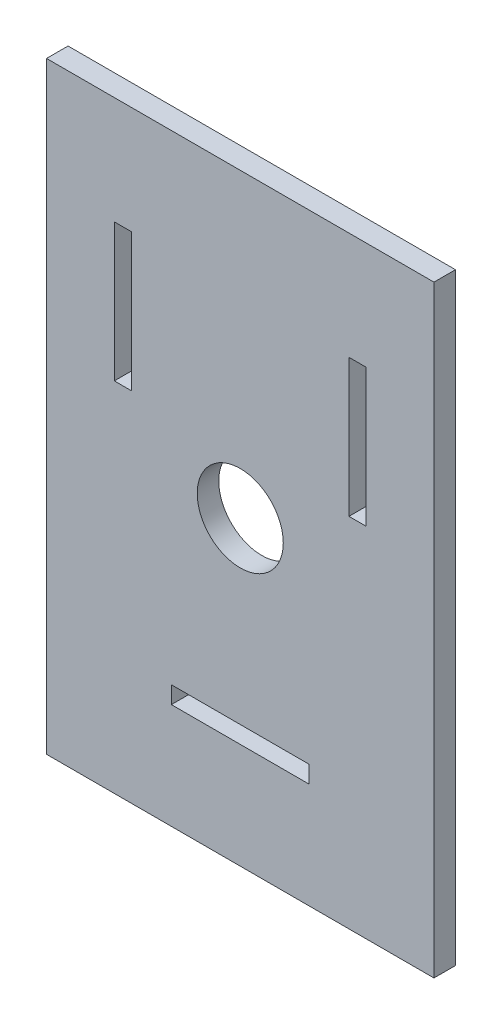
ISO-10303-21;
HEADER;
FILE_DESCRIPTION(('STEP AP214'),'2;1');
FILE_NAME('part.step','',(''),(''),'','','');
FILE_SCHEMA(('AUTOMOTIVE_DESIGN { 1 0 10303 214 1 1 1 1 }'));
ENDSEC;
DATA;
#1=APPLICATION_CONTEXT('core data for automotive mechanical design processes');
#2=APPLICATION_PROTOCOL_DEFINITION('international standard','automotive_design',2000,#1);
#3=PRODUCT_CONTEXT('',#1,'mechanical');
#4=PRODUCT('Part','Part','',(#3));
#5=PRODUCT_RELATED_PRODUCT_CATEGORY('part','',(#4));
#6=PRODUCT_DEFINITION_FORMATION('','',#4);
#7=PRODUCT_DEFINITION_CONTEXT('part definition',#1,'design');
#8=PRODUCT_DEFINITION('design','',#6,#7);
#9=PRODUCT_DEFINITION_SHAPE('','',#8);
#10=(LENGTH_UNIT() NAMED_UNIT(*) SI_UNIT(.MILLI.,.METRE.));
#11=(NAMED_UNIT(*) PLANE_ANGLE_UNIT() SI_UNIT($,.RADIAN.));
#12=(NAMED_UNIT(*) SI_UNIT($,.STERADIAN.) SOLID_ANGLE_UNIT());
#13=UNCERTAINTY_MEASURE_WITH_UNIT(LENGTH_MEASURE(1.E-05),#10,'distance_accuracy_value','');
#14=(GEOMETRIC_REPRESENTATION_CONTEXT(3) GLOBAL_UNCERTAINTY_ASSIGNED_CONTEXT((#13)) GLOBAL_UNIT_ASSIGNED_CONTEXT((#10,
#11,#12)) REPRESENTATION_CONTEXT('',''));
#15=CARTESIAN_POINT('',(0.,0.,0.));
#16=DIRECTION('',(0.,0.,1.));
#17=DIRECTION('',(1.,0.,0.));
#18=AXIS2_PLACEMENT_3D('',#15,#16,#17);
#19=CARTESIAN_POINT('',(0.,0.,-1.));
#20=DIRECTION('',(0.,0.,1.));
#21=DIRECTION('',(1.,0.,0.));
#22=AXIS2_PLACEMENT_3D('',#19,#20,#21);
#23=PLANE('',#22);
#24=DIRECTION('',(1.,0.,0.));
#25=VECTOR('',#24,1.);
#26=CARTESIAN_POINT('',(0.,-9.09999999999999,-1.));
#27=LINE('',#26,#25);
#28=CARTESIAN_POINT('',(-3.2,-9.09999999999999,-1.));
#29=VERTEX_POINT('',#28);
#30=CARTESIAN_POINT('',(3.2,-9.09999999999999,-1.));
#31=VERTEX_POINT('',#30);
#32=EDGE_CURVE('E162',#29,#31,#27,.T.);
#33=ORIENTED_EDGE('',*,*,#32,.T.);
#34=DIRECTION('',(0.,1.,0.));
#35=VECTOR('',#34,1.);
#36=CARTESIAN_POINT('',(3.2,0.,-1.));
#37=LINE('',#36,#35);
#38=CARTESIAN_POINT('',(3.2,-8.29999999999999,-1.));
#39=VERTEX_POINT('',#38);
#40=EDGE_CURVE('E165',#31,#39,#37,.T.);
#41=ORIENTED_EDGE('',*,*,#40,.T.);
#42=DIRECTION('',(-1.,0.,0.));
#43=VECTOR('',#42,1.);
#44=CARTESIAN_POINT('',(0.,-8.29999999999999,-1.));
#45=LINE('',#44,#43);
#46=CARTESIAN_POINT('',(-3.2,-8.29999999999999,-1.));
#47=VERTEX_POINT('',#46);
#48=EDGE_CURVE('E157',#39,#47,#45,.T.);
#49=ORIENTED_EDGE('',*,*,#48,.T.);
#50=DIRECTION('',(0.,-1.,0.));
#51=VECTOR('',#50,1.);
#52=CARTESIAN_POINT('',(-3.2,0.,-1.));
#53=LINE('',#52,#51);
#54=EDGE_CURVE('E137',#47,#29,#53,.T.);
#55=ORIENTED_EDGE('',*,*,#54,.T.);
#56=EDGE_LOOP('',(#33,#41,#49,#55));
#57=FACE_BOUND('',#56,.T.);
#58=CARTESIAN_POINT('',(0.,0.,-1.));
#59=DIRECTION('',(0.,0.,1.));
#60=DIRECTION('',(1.,0.,0.));
#61=AXIS2_PLACEMENT_3D('',#58,#59,#60);
#62=CIRCLE('',#61,2.);
#63=CARTESIAN_POINT('',(2.,0.,-1.));
#64=VERTEX_POINT('',#63);
#65=EDGE_CURVE('E169',#64,#64,#62,.T.);
#66=ORIENTED_EDGE('',*,*,#65,.T.);
#67=EDGE_LOOP('',(#66));
#68=FACE_BOUND('',#67,.T.);
#69=DIRECTION('',(0.,1.,0.));
#70=VECTOR('',#69,1.);
#71=CARTESIAN_POINT('',(8.99999999999999,14.,-1.));
#72=LINE('',#71,#70);
#73=CARTESIAN_POINT('',(9.,-14.,-1.));
#74=VERTEX_POINT('',#73);
#75=CARTESIAN_POINT('',(8.99999999999999,14.,-1.));
#76=VERTEX_POINT('',#75);
#77=EDGE_CURVE('E237',#74,#76,#72,.T.);
#78=ORIENTED_EDGE('',*,*,#77,.F.);
#79=DIRECTION('',(1.,0.,0.));
#80=VECTOR('',#79,1.);
#81=CARTESIAN_POINT('',(-9.,-14.,-1.));
#82=LINE('',#81,#80);
#83=CARTESIAN_POINT('',(-9.,-14.,-1.));
#84=VERTEX_POINT('',#83);
#85=EDGE_CURVE('E247',#84,#74,#82,.T.);
#86=ORIENTED_EDGE('',*,*,#85,.F.);
#87=DIRECTION('',(0.,-1.,0.));
#88=VECTOR('',#87,1.);
#89=CARTESIAN_POINT('',(-9.00000000000001,14.,-1.));
#90=LINE('',#89,#88);
#91=CARTESIAN_POINT('',(-9.00000000000001,14.,-1.));
#92=VERTEX_POINT('',#91);
#93=EDGE_CURVE('E244',#92,#84,#90,.T.);
#94=ORIENTED_EDGE('',*,*,#93,.F.);
#95=DIRECTION('',(-1.,0.,0.));
#96=VECTOR('',#95,1.);
#97=CARTESIAN_POINT('',(-9.00000000000001,14.,-1.));
#98=LINE('',#97,#96);
#99=EDGE_CURVE('E240',#76,#92,#98,.T.);
#100=ORIENTED_EDGE('',*,*,#99,.F.);
#101=EDGE_LOOP('',(#78,#86,#94,#100));
#102=FACE_BOUND('',#101,.T.);
#103=DIRECTION('',(1.,0.,0.));
#104=VECTOR('',#103,1.);
#105=CARTESIAN_POINT('',(0.,2.60000000000001,-1.));
#106=LINE('',#105,#104);
#107=CARTESIAN_POINT('',(5.05,2.60000000000001,-1.));
#108=VERTEX_POINT('',#107);
#109=CARTESIAN_POINT('',(5.85,2.60000000000001,-1.));
#110=VERTEX_POINT('',#109);
#111=EDGE_CURVE('E230',#108,#110,#106,.T.);
#112=ORIENTED_EDGE('',*,*,#111,.T.);
#113=DIRECTION('',(0.,1.,0.));
#114=VECTOR('',#113,1.);
#115=CARTESIAN_POINT('',(5.85,0.,-1.));
#116=LINE('',#115,#114);
#117=CARTESIAN_POINT('',(5.85,9.00000000000001,-1.));
#118=VERTEX_POINT('',#117);
#119=EDGE_CURVE('E233',#110,#118,#116,.T.);
#120=ORIENTED_EDGE('',*,*,#119,.T.);
#121=DIRECTION('',(-1.,0.,0.));
#122=VECTOR('',#121,1.);
#123=CARTESIAN_POINT('',(0.,9.00000000000001,-1.));
#124=LINE('',#123,#122);
#125=CARTESIAN_POINT('',(5.05,9.00000000000001,-1.));
#126=VERTEX_POINT('',#125);
#127=EDGE_CURVE('E218',#118,#126,#124,.T.);
#128=ORIENTED_EDGE('',*,*,#127,.T.);
#129=DIRECTION('',(0.,-1.,0.));
#130=VECTOR('',#129,1.);
#131=CARTESIAN_POINT('',(5.05,0.,-1.));
#132=LINE('',#131,#130);
#133=EDGE_CURVE('E227',#126,#108,#132,.T.);
#134=ORIENTED_EDGE('',*,*,#133,.T.);
#135=EDGE_LOOP('',(#112,#120,#128,#134));
#136=FACE_BOUND('',#135,.T.);
#137=DIRECTION('',(0.,1.,0.));
#138=VECTOR('',#137,1.);
#139=CARTESIAN_POINT('',(-5.85,0.,-1.));
#140=LINE('',#139,#138);
#141=CARTESIAN_POINT('',(-5.85,2.60000000000001,-1.));
#142=VERTEX_POINT('',#141);
#143=CARTESIAN_POINT('',(-5.85,9.00000000000001,-1.));
#144=VERTEX_POINT('',#143);
#145=EDGE_CURVE('E202',#142,#144,#140,.T.);
#146=ORIENTED_EDGE('',*,*,#145,.F.);
#147=DIRECTION('',(-1.,0.,0.));
#148=VECTOR('',#147,1.);
#149=CARTESIAN_POINT('',(0.,2.60000000000001,-1.));
#150=LINE('',#149,#148);
#151=CARTESIAN_POINT('',(-5.05,2.60000000000001,-1.));
#152=VERTEX_POINT('',#151);
#153=EDGE_CURVE('E189',#152,#142,#150,.T.);
#154=ORIENTED_EDGE('',*,*,#153,.F.);
#155=DIRECTION('',(0.,-1.,0.));
#156=VECTOR('',#155,1.);
#157=CARTESIAN_POINT('',(-5.05,0.,-1.));
#158=LINE('',#157,#156);
#159=CARTESIAN_POINT('',(-5.05,9.00000000000001,-1.));
#160=VERTEX_POINT('',#159);
#161=EDGE_CURVE('E197',#160,#152,#158,.T.);
#162=ORIENTED_EDGE('',*,*,#161,.F.);
#163=DIRECTION('',(1.,0.,0.));
#164=VECTOR('',#163,1.);
#165=CARTESIAN_POINT('',(0.,9.00000000000001,-1.));
#166=LINE('',#165,#164);
#167=EDGE_CURVE('E200',#144,#160,#166,.T.);
#168=ORIENTED_EDGE('',*,*,#167,.F.);
#169=EDGE_LOOP('',(#146,#154,#162,#168));
#170=FACE_BOUND('',#169,.T.);
#171=ADVANCED_FACE('F17',(#57,#68,#102,#136,#170),#23,.F.);
#172=CARTESIAN_POINT('',(0.,0.,0.));
#173=DIRECTION('',(0.,0.,1.));
#174=DIRECTION('',(1.,0.,0.));
#175=AXIS2_PLACEMENT_3D('',#172,#173,#174);
#176=PLANE('',#175);
#177=DIRECTION('',(0.,1.,0.));
#178=VECTOR('',#177,1.);
#179=CARTESIAN_POINT('',(3.2,-8.29999999999999,0.));
#180=LINE('',#179,#178);
#181=CARTESIAN_POINT('',(3.2,-9.09999999999999,0.));
#182=VERTEX_POINT('',#181);
#183=CARTESIAN_POINT('',(3.2,-8.29999999999999,0.));
#184=VERTEX_POINT('',#183);
#185=EDGE_CURVE('E42',#182,#184,#180,.T.);
#186=ORIENTED_EDGE('',*,*,#185,.F.);
#187=DIRECTION('',(1.,0.,0.));
#188=VECTOR('',#187,1.);
#189=CARTESIAN_POINT('',(-3.2,-9.09999999999999,0.));
#190=LINE('',#189,#188);
#191=CARTESIAN_POINT('',(-3.2,-9.09999999999999,0.));
#192=VERTEX_POINT('',#191);
#193=EDGE_CURVE('E150',#192,#182,#190,.T.);
#194=ORIENTED_EDGE('',*,*,#193,.F.);
#195=DIRECTION('',(0.,-1.,0.));
#196=VECTOR('',#195,1.);
#197=CARTESIAN_POINT('',(-3.2,-8.29999999999999,0.));
#198=LINE('',#197,#196);
#199=CARTESIAN_POINT('',(-3.2,-8.29999999999999,0.));
#200=VERTEX_POINT('',#199);
#201=EDGE_CURVE('E134',#200,#192,#198,.T.);
#202=ORIENTED_EDGE('',*,*,#201,.F.);
#203=DIRECTION('',(-1.,0.,0.));
#204=VECTOR('',#203,1.);
#205=CARTESIAN_POINT('',(-3.2,-8.29999999999999,0.));
#206=LINE('',#205,#204);
#207=EDGE_CURVE('E143',#184,#200,#206,.T.);
#208=ORIENTED_EDGE('',*,*,#207,.F.);
#209=EDGE_LOOP('',(#186,#194,#202,#208));
#210=FACE_BOUND('',#209,.T.);
#211=CARTESIAN_POINT('',(0.,0.,0.));
#212=DIRECTION('',(0.,0.,1.));
#213=DIRECTION('',(1.,0.,0.));
#214=AXIS2_PLACEMENT_3D('',#211,#212,#213);
#215=CIRCLE('',#214,2.);
#216=CARTESIAN_POINT('',(2.,0.,0.));
#217=VERTEX_POINT('',#216);
#218=EDGE_CURVE('E168',#217,#217,#215,.T.);
#219=ORIENTED_EDGE('',*,*,#218,.F.);
#220=EDGE_LOOP('',(#219));
#221=FACE_BOUND('',#220,.T.);
#222=DIRECTION('',(0.,1.,0.));
#223=VECTOR('',#222,1.);
#224=CARTESIAN_POINT('',(5.85,9.00000000000001,0.));
#225=LINE('',#224,#223);
#226=CARTESIAN_POINT('',(5.85,2.60000000000001,0.));
#227=VERTEX_POINT('',#226);
#228=CARTESIAN_POINT('',(5.85,9.00000000000001,0.));
#229=VERTEX_POINT('',#228);
#230=EDGE_CURVE('E204',#227,#229,#225,.T.);
#231=ORIENTED_EDGE('',*,*,#230,.F.);
#232=DIRECTION('',(1.,0.,0.));
#233=VECTOR('',#232,1.);
#234=CARTESIAN_POINT('',(5.05,2.60000000000001,0.));
#235=LINE('',#234,#233);
#236=CARTESIAN_POINT('',(5.05,2.60000000000001,0.));
#237=VERTEX_POINT('',#236);
#238=EDGE_CURVE('E212',#237,#227,#235,.T.);
#239=ORIENTED_EDGE('',*,*,#238,.F.);
#240=DIRECTION('',(0.,-1.,0.));
#241=VECTOR('',#240,1.);
#242=CARTESIAN_POINT('',(5.05,9.00000000000001,0.));
#243=LINE('',#242,#241);
#244=CARTESIAN_POINT('',(5.05,9.00000000000001,0.));
#245=VERTEX_POINT('',#244);
#246=EDGE_CURVE('E209',#245,#237,#243,.T.);
#247=ORIENTED_EDGE('',*,*,#246,.F.);
#248=DIRECTION('',(-1.,0.,0.));
#249=VECTOR('',#248,1.);
#250=CARTESIAN_POINT('',(5.05,9.00000000000001,0.));
#251=LINE('',#250,#249);
#252=EDGE_CURVE('E206',#229,#245,#251,.T.);
#253=ORIENTED_EDGE('',*,*,#252,.F.);
#254=EDGE_LOOP('',(#231,#239,#247,#253));
#255=FACE_BOUND('',#254,.T.);
#256=DIRECTION('',(0.,1.,0.));
#257=VECTOR('',#256,1.);
#258=CARTESIAN_POINT('',(8.99999999999999,14.,0.));
#259=LINE('',#258,#257);
#260=CARTESIAN_POINT('',(9.,-14.,0.));
#261=VERTEX_POINT('',#260);
#262=CARTESIAN_POINT('',(8.99999999999999,14.,0.));
#263=VERTEX_POINT('',#262);
#264=EDGE_CURVE('E236',#261,#263,#259,.T.);
#265=ORIENTED_EDGE('',*,*,#264,.T.);
#266=DIRECTION('',(-1.,0.,0.));
#267=VECTOR('',#266,1.);
#268=CARTESIAN_POINT('',(-9.00000000000001,14.,0.));
#269=LINE('',#268,#267);
#270=CARTESIAN_POINT('',(-9.00000000000001,14.,0.));
#271=VERTEX_POINT('',#270);
#272=EDGE_CURVE('E252',#263,#271,#269,.T.);
#273=ORIENTED_EDGE('',*,*,#272,.T.);
#274=DIRECTION('',(0.,-1.,0.));
#275=VECTOR('',#274,1.);
#276=CARTESIAN_POINT('',(-9.00000000000001,14.,0.));
#277=LINE('',#276,#275);
#278=CARTESIAN_POINT('',(-9.,-14.,0.));
#279=VERTEX_POINT('',#278);
#280=EDGE_CURVE('E255',#271,#279,#277,.T.);
#281=ORIENTED_EDGE('',*,*,#280,.T.);
#282=DIRECTION('',(1.,0.,0.));
#283=VECTOR('',#282,1.);
#284=CARTESIAN_POINT('',(-9.,-14.,0.));
#285=LINE('',#284,#283);
#286=EDGE_CURVE('E241',#279,#261,#285,.T.);
#287=ORIENTED_EDGE('',*,*,#286,.T.);
#288=EDGE_LOOP('',(#265,#273,#281,#287));
#289=FACE_BOUND('',#288,.T.);
#290=DIRECTION('',(-1.,0.,0.));
#291=VECTOR('',#290,1.);
#292=CARTESIAN_POINT('',(-5.05,2.60000000000001,0.));
#293=LINE('',#292,#291);
#294=CARTESIAN_POINT('',(-5.05,2.60000000000001,0.));
#295=VERTEX_POINT('',#294);
#296=CARTESIAN_POINT('',(-5.85,2.60000000000001,0.));
#297=VERTEX_POINT('',#296);
#298=EDGE_CURVE('E177',#295,#297,#293,.T.);
#299=ORIENTED_EDGE('',*,*,#298,.T.);
#300=DIRECTION('',(0.,1.,0.));
#301=VECTOR('',#300,1.);
#302=CARTESIAN_POINT('',(-5.85,9.00000000000001,0.));
#303=LINE('',#302,#301);
#304=CARTESIAN_POINT('',(-5.85,9.00000000000001,0.));
#305=VERTEX_POINT('',#304);
#306=EDGE_CURVE('E172',#297,#305,#303,.T.);
#307=ORIENTED_EDGE('',*,*,#306,.T.);
#308=DIRECTION('',(1.,0.,0.));
#309=VECTOR('',#308,1.);
#310=CARTESIAN_POINT('',(-5.05,9.00000000000001,0.));
#311=LINE('',#310,#309);
#312=CARTESIAN_POINT('',(-5.05,9.00000000000001,0.));
#313=VERTEX_POINT('',#312);
#314=EDGE_CURVE('E183',#305,#313,#311,.T.);
#315=ORIENTED_EDGE('',*,*,#314,.T.);
#316=DIRECTION('',(0.,-1.,0.));
#317=VECTOR('',#316,1.);
#318=CARTESIAN_POINT('',(-5.05,9.00000000000001,0.));
#319=LINE('',#318,#317);
#320=EDGE_CURVE('E180',#313,#295,#319,.T.);
#321=ORIENTED_EDGE('',*,*,#320,.T.);
#322=EDGE_LOOP('',(#299,#307,#315,#321));
#323=FACE_BOUND('',#322,.T.);
#324=ADVANCED_FACE('F147',(#210,#221,#255,#289,#323),#176,.T.);
#325=CARTESIAN_POINT('',(8.99999999999999,14.,-1.));
#326=DIRECTION('',(1.,0.,0.));
#327=DIRECTION('',(0.,1.,0.));
#328=AXIS2_PLACEMENT_3D('',#325,#326,#327);
#329=PLANE('',#328);
#330=ORIENTED_EDGE('',*,*,#264,.F.);
#331=DIRECTION('',(0.,0.,1.));
#332=VECTOR('',#331,1.);
#333=CARTESIAN_POINT('',(9.,-14.,-1.));
#334=LINE('',#333,#332);
#335=EDGE_CURVE('E11',#74,#261,#334,.T.);
#336=ORIENTED_EDGE('',*,*,#335,.F.);
#337=ORIENTED_EDGE('',*,*,#77,.T.);
#338=DIRECTION('',(0.,0.,1.));
#339=VECTOR('',#338,1.);
#340=CARTESIAN_POINT('',(8.99999999999999,14.,-1.));
#341=LINE('',#340,#339);
#342=EDGE_CURVE('E21',#76,#263,#341,.T.);
#343=ORIENTED_EDGE('',*,*,#342,.T.);
#344=EDGE_LOOP('',(#330,#336,#337,#343));
#345=FACE_BOUND('',#344,.T.);
#346=ADVANCED_FACE('F19',(#345),#329,.T.);
#347=CARTESIAN_POINT('',(-9.,-14.,-1.));
#348=DIRECTION('',(0.,-1.,0.));
#349=DIRECTION('',(0.,0.,-1.));
#350=AXIS2_PLACEMENT_3D('',#347,#348,#349);
#351=PLANE('',#350);
#352=ORIENTED_EDGE('',*,*,#286,.F.);
#353=DIRECTION('',(0.,0.,1.));
#354=VECTOR('',#353,1.);
#355=CARTESIAN_POINT('',(-9.,-14.,-1.));
#356=LINE('',#355,#354);
#357=EDGE_CURVE('E26',#84,#279,#356,.T.);
#358=ORIENTED_EDGE('',*,*,#357,.F.);
#359=ORIENTED_EDGE('',*,*,#85,.T.);
#360=ORIENTED_EDGE('',*,*,#335,.T.);
#361=EDGE_LOOP('',(#352,#358,#359,#360));
#362=FACE_BOUND('',#361,.T.);
#363=ADVANCED_FACE('F273',(#362),#351,.T.);
#364=CARTESIAN_POINT('',(-9.00000000000001,14.,-1.));
#365=DIRECTION('',(-1.,0.,0.));
#366=DIRECTION('',(0.,-1.,0.));
#367=AXIS2_PLACEMENT_3D('',#364,#365,#366);
#368=PLANE('',#367);
#369=ORIENTED_EDGE('',*,*,#280,.F.);
#370=DIRECTION('',(0.,0.,1.));
#371=VECTOR('',#370,1.);
#372=CARTESIAN_POINT('',(-9.00000000000001,14.,-1.));
#373=LINE('',#372,#371);
#374=EDGE_CURVE('E260',#92,#271,#373,.T.);
#375=ORIENTED_EDGE('',*,*,#374,.F.);
#376=ORIENTED_EDGE('',*,*,#93,.T.);
#377=ORIENTED_EDGE('',*,*,#357,.T.);
#378=EDGE_LOOP('',(#369,#375,#376,#377));
#379=FACE_BOUND('',#378,.T.);
#380=ADVANCED_FACE('F279',(#379),#368,.T.);
#381=CARTESIAN_POINT('',(-9.00000000000001,14.,-1.));
#382=DIRECTION('',(0.,1.,0.));
#383=DIRECTION('',(0.,0.,1.));
#384=AXIS2_PLACEMENT_3D('',#381,#382,#383);
#385=PLANE('',#384);
#386=ORIENTED_EDGE('',*,*,#272,.F.);
#387=ORIENTED_EDGE('',*,*,#342,.F.);
#388=ORIENTED_EDGE('',*,*,#99,.T.);
#389=ORIENTED_EDGE('',*,*,#374,.T.);
#390=EDGE_LOOP('',(#386,#387,#388,#389));
#391=FACE_BOUND('',#390,.T.);
#392=ADVANCED_FACE('F268',(#391),#385,.T.);
#393=CARTESIAN_POINT('',(5.85,9.00000000000001,-1.6));
#394=DIRECTION('',(1.,0.,0.));
#395=DIRECTION('',(0.,1.,0.));
#396=AXIS2_PLACEMENT_3D('',#393,#394,#395);
#397=PLANE('',#396);
#398=DIRECTION('',(0.,0.,1.));
#399=VECTOR('',#398,1.);
#400=CARTESIAN_POINT('',(5.85,2.60000000000001,-1.6));
#401=LINE('',#400,#399);
#402=EDGE_CURVE('E216',#110,#227,#401,.T.);
#403=ORIENTED_EDGE('',*,*,#402,.T.);
#404=ORIENTED_EDGE('',*,*,#230,.T.);
#405=DIRECTION('',(0.,0.,1.));
#406=VECTOR('',#405,1.);
#407=CARTESIAN_POINT('',(5.85,9.00000000000001,-1.6));
#408=LINE('',#407,#406);
#409=EDGE_CURVE('E215',#118,#229,#408,.T.);
#410=ORIENTED_EDGE('',*,*,#409,.F.);
#411=ORIENTED_EDGE('',*,*,#119,.F.);
#412=EDGE_LOOP('',(#403,#404,#410,#411));
#413=FACE_BOUND('',#412,.T.);
#414=ADVANCED_FACE('F288',(#413),#397,.F.);
#415=CARTESIAN_POINT('',(5.05,2.60000000000001,-1.6));
#416=DIRECTION('',(0.,-1.,0.));
#417=DIRECTION('',(0.,0.,-1.));
#418=AXIS2_PLACEMENT_3D('',#415,#416,#417);
#419=PLANE('',#418);
#420=DIRECTION('',(0.,0.,1.));
#421=VECTOR('',#420,1.);
#422=CARTESIAN_POINT('',(5.05,2.60000000000001,-1.6));
#423=LINE('',#422,#421);
#424=EDGE_CURVE('E219',#108,#237,#423,.T.);
#425=ORIENTED_EDGE('',*,*,#424,.T.);
#426=ORIENTED_EDGE('',*,*,#238,.T.);
#427=ORIENTED_EDGE('',*,*,#402,.F.);
#428=ORIENTED_EDGE('',*,*,#111,.F.);
#429=EDGE_LOOP('',(#425,#426,#427,#428));
#430=FACE_BOUND('',#429,.T.);
#431=ADVANCED_FACE('F302',(#430),#419,.F.);
#432=CARTESIAN_POINT('',(5.05,9.00000000000001,-1.6));
#433=DIRECTION('',(-1.,0.,0.));
#434=DIRECTION('',(0.,-1.,0.));
#435=AXIS2_PLACEMENT_3D('',#432,#433,#434);
#436=PLANE('',#435);
#437=DIRECTION('',(0.,0.,1.));
#438=VECTOR('',#437,1.);
#439=CARTESIAN_POINT('',(5.05,9.00000000000001,-1.6));
#440=LINE('',#439,#438);
#441=EDGE_CURVE('E221',#126,#245,#440,.T.);
#442=ORIENTED_EDGE('',*,*,#441,.T.);
#443=ORIENTED_EDGE('',*,*,#246,.T.);
#444=ORIENTED_EDGE('',*,*,#424,.F.);
#445=ORIENTED_EDGE('',*,*,#133,.F.);
#446=EDGE_LOOP('',(#442,#443,#444,#445));
#447=FACE_BOUND('',#446,.T.);
#448=ADVANCED_FACE('F308',(#447),#436,.F.);
#449=CARTESIAN_POINT('',(5.05,9.00000000000001,-1.6));
#450=DIRECTION('',(0.,1.,0.));
#451=DIRECTION('',(0.,0.,1.));
#452=AXIS2_PLACEMENT_3D('',#449,#450,#451);
#453=PLANE('',#452);
#454=ORIENTED_EDGE('',*,*,#409,.T.);
#455=ORIENTED_EDGE('',*,*,#252,.T.);
#456=ORIENTED_EDGE('',*,*,#441,.F.);
#457=ORIENTED_EDGE('',*,*,#127,.F.);
#458=EDGE_LOOP('',(#454,#455,#456,#457));
#459=FACE_BOUND('',#458,.T.);
#460=ADVANCED_FACE('F304',(#459),#453,.F.);
#461=CARTESIAN_POINT('',(-5.85,9.00000000000001,-1.6));
#462=DIRECTION('',(1.,0.,0.));
#463=DIRECTION('',(0.,1.,0.));
#464=AXIS2_PLACEMENT_3D('',#461,#462,#463);
#465=PLANE('',#464);
#466=ORIENTED_EDGE('',*,*,#145,.T.);
#467=DIRECTION('',(0.,0.,1.));
#468=VECTOR('',#467,1.);
#469=CARTESIAN_POINT('',(-5.85,9.00000000000001,-1.6));
#470=LINE('',#469,#468);
#471=EDGE_CURVE('E187',#144,#305,#470,.T.);
#472=ORIENTED_EDGE('',*,*,#471,.T.);
#473=ORIENTED_EDGE('',*,*,#306,.F.);
#474=DIRECTION('',(0.,0.,1.));
#475=VECTOR('',#474,1.);
#476=CARTESIAN_POINT('',(-5.85,2.60000000000001,-1.6));
#477=LINE('',#476,#475);
#478=EDGE_CURVE('E186',#142,#297,#477,.T.);
#479=ORIENTED_EDGE('',*,*,#478,.F.);
#480=EDGE_LOOP('',(#466,#472,#473,#479));
#481=FACE_BOUND('',#480,.T.);
#482=ADVANCED_FACE('F307',(#481),#465,.T.);
#483=CARTESIAN_POINT('',(-5.05,9.00000000000001,-1.6));
#484=DIRECTION('',(0.,-1.,0.));
#485=DIRECTION('',(0.,0.,-1.));
#486=AXIS2_PLACEMENT_3D('',#483,#484,#485);
#487=PLANE('',#486);
#488=ORIENTED_EDGE('',*,*,#167,.T.);
#489=DIRECTION('',(0.,0.,1.));
#490=VECTOR('',#489,1.);
#491=CARTESIAN_POINT('',(-5.05,9.00000000000001,-1.6));
#492=LINE('',#491,#490);
#493=EDGE_CURVE('E190',#160,#313,#492,.T.);
#494=ORIENTED_EDGE('',*,*,#493,.T.);
#495=ORIENTED_EDGE('',*,*,#314,.F.);
#496=ORIENTED_EDGE('',*,*,#471,.F.);
#497=EDGE_LOOP('',(#488,#494,#495,#496));
#498=FACE_BOUND('',#497,.T.);
#499=ADVANCED_FACE('F318',(#498),#487,.T.);
#500=CARTESIAN_POINT('',(-5.05,9.00000000000001,-1.6));
#501=DIRECTION('',(-1.,0.,0.));
#502=DIRECTION('',(0.,-1.,0.));
#503=AXIS2_PLACEMENT_3D('',#500,#501,#502);
#504=PLANE('',#503);
#505=ORIENTED_EDGE('',*,*,#161,.T.);
#506=DIRECTION('',(0.,0.,1.));
#507=VECTOR('',#506,1.);
#508=CARTESIAN_POINT('',(-5.05,2.60000000000001,-1.6));
#509=LINE('',#508,#507);
#510=EDGE_CURVE('E192',#152,#295,#509,.T.);
#511=ORIENTED_EDGE('',*,*,#510,.T.);
#512=ORIENTED_EDGE('',*,*,#320,.F.);
#513=ORIENTED_EDGE('',*,*,#493,.F.);
#514=EDGE_LOOP('',(#505,#511,#512,#513));
#515=FACE_BOUND('',#514,.T.);
#516=ADVANCED_FACE('F324',(#515),#504,.T.);
#517=CARTESIAN_POINT('',(-5.05,2.60000000000001,-1.6));
#518=DIRECTION('',(0.,1.,0.));
#519=DIRECTION('',(0.,0.,1.));
#520=AXIS2_PLACEMENT_3D('',#517,#518,#519);
#521=PLANE('',#520);
#522=ORIENTED_EDGE('',*,*,#153,.T.);
#523=ORIENTED_EDGE('',*,*,#478,.T.);
#524=ORIENTED_EDGE('',*,*,#298,.F.);
#525=ORIENTED_EDGE('',*,*,#510,.F.);
#526=EDGE_LOOP('',(#522,#523,#524,#525));
#527=FACE_BOUND('',#526,.T.);
#528=ADVANCED_FACE('F320',(#527),#521,.T.);
#529=CARTESIAN_POINT('',(0.,0.,-1.));
#530=DIRECTION('',(0.,0.,1.));
#531=DIRECTION('',(1.,0.,0.));
#532=AXIS2_PLACEMENT_3D('',#529,#530,#531);
#533=CYLINDRICAL_SURFACE('',#532,2.);
#534=ORIENTED_EDGE('',*,*,#65,.F.);
#535=EDGE_LOOP('',(#534));
#536=FACE_BOUND('',#535,.T.);
#537=ORIENTED_EDGE('',*,*,#218,.T.);
#538=EDGE_LOOP('',(#537));
#539=FACE_BOUND('',#538,.T.);
#540=ADVANCED_FACE('F323',(#536,#539),#533,.F.);
#541=CARTESIAN_POINT('',(3.2,-8.29999999999999,-1.6));
#542=DIRECTION('',(1.,0.,0.));
#543=DIRECTION('',(0.,0.,-1.));
#544=AXIS2_PLACEMENT_3D('',#541,#542,#543);
#545=PLANE('',#544);
#546=DIRECTION('',(0.,0.,1.));
#547=VECTOR('',#546,1.);
#548=CARTESIAN_POINT('',(3.2,-9.09999999999999,-1.6));
#549=LINE('',#548,#547);
#550=EDGE_CURVE('E155',#31,#182,#549,.T.);
#551=ORIENTED_EDGE('',*,*,#550,.T.);
#552=ORIENTED_EDGE('',*,*,#185,.T.);
#553=DIRECTION('',(0.,0.,1.));
#554=VECTOR('',#553,1.);
#555=CARTESIAN_POINT('',(3.2,-8.29999999999999,-1.6));
#556=LINE('',#555,#554);
#557=EDGE_CURVE('E140',#39,#184,#556,.T.);
#558=ORIENTED_EDGE('',*,*,#557,.F.);
#559=ORIENTED_EDGE('',*,*,#40,.F.);
#560=EDGE_LOOP('',(#551,#552,#558,#559));
#561=FACE_BOUND('',#560,.T.);
#562=ADVANCED_FACE('F334',(#561),#545,.F.);
#563=CARTESIAN_POINT('',(-3.2,-9.09999999999999,-1.6));
#564=DIRECTION('',(0.,-1.,0.));
#565=DIRECTION('',(0.,0.,-1.));
#566=AXIS2_PLACEMENT_3D('',#563,#564,#565);
#567=PLANE('',#566);
#568=DIRECTION('',(0.,0.,1.));
#569=VECTOR('',#568,1.);
#570=CARTESIAN_POINT('',(-3.2,-9.09999999999999,-1.6));
#571=LINE('',#570,#569);
#572=EDGE_CURVE('E139',#29,#192,#571,.T.);
#573=ORIENTED_EDGE('',*,*,#572,.T.);
#574=ORIENTED_EDGE('',*,*,#193,.T.);
#575=ORIENTED_EDGE('',*,*,#550,.F.);
#576=ORIENTED_EDGE('',*,*,#32,.F.);
#577=EDGE_LOOP('',(#573,#574,#575,#576));
#578=FACE_BOUND('',#577,.T.);
#579=ADVANCED_FACE('F338',(#578),#567,.F.);
#580=CARTESIAN_POINT('',(-3.2,-8.29999999999999,-1.6));
#581=DIRECTION('',(-1.,0.,0.));
#582=DIRECTION('',(0.,-1.,0.));
#583=AXIS2_PLACEMENT_3D('',#580,#581,#582);
#584=PLANE('',#583);
#585=DIRECTION('',(0.,0.,1.));
#586=VECTOR('',#585,1.);
#587=CARTESIAN_POINT('',(-3.2,-8.29999999999999,-1.6));
#588=LINE('',#587,#586);
#589=EDGE_CURVE('E34',#47,#200,#588,.T.);
#590=ORIENTED_EDGE('',*,*,#589,.T.);
#591=ORIENTED_EDGE('',*,*,#201,.T.);
#592=ORIENTED_EDGE('',*,*,#572,.F.);
#593=ORIENTED_EDGE('',*,*,#54,.F.);
#594=EDGE_LOOP('',(#590,#591,#592,#593));
#595=FACE_BOUND('',#594,.T.);
#596=ADVANCED_FACE('F131',(#595),#584,.F.);
#597=CARTESIAN_POINT('',(-3.2,-8.29999999999999,-1.6));
#598=DIRECTION('',(0.,1.,0.));
#599=DIRECTION('',(0.,0.,1.));
#600=AXIS2_PLACEMENT_3D('',#597,#598,#599);
#601=PLANE('',#600);
#602=ORIENTED_EDGE('',*,*,#557,.T.);
#603=ORIENTED_EDGE('',*,*,#207,.T.);
#604=ORIENTED_EDGE('',*,*,#589,.F.);
#605=ORIENTED_EDGE('',*,*,#48,.F.);
#606=EDGE_LOOP('',(#602,#603,#604,#605));
#607=FACE_BOUND('',#606,.T.);
#608=ADVANCED_FACE('F144',(#607),#601,.F.);
#609=CLOSED_SHELL('',(#171,#324,#346,#363,#380,#392,#414,#431,#448,#460,#482,#499,#516,#528,
#540,#562,#579,#596,#608));
#610=MANIFOLD_SOLID_BREP('B1',#609);
#611=ADVANCED_BREP_SHAPE_REPRESENTATION('',(#18,#610),#14);
#612=SHAPE_DEFINITION_REPRESENTATION(#9,#611);
ENDSEC;
END-ISO-10303-21;
